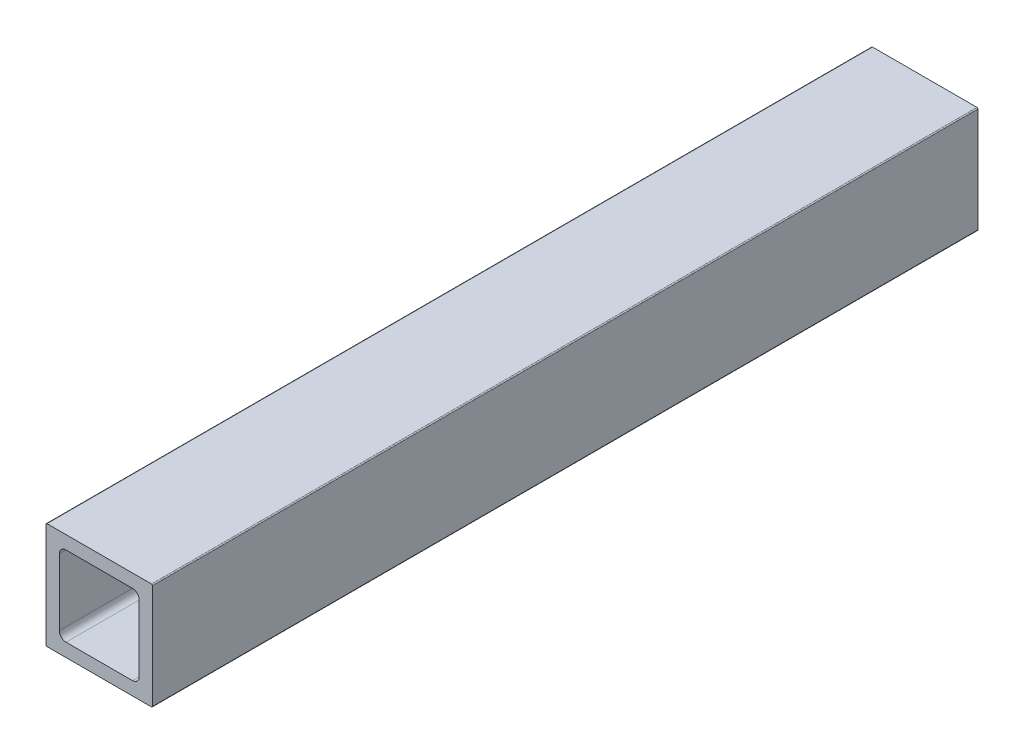
ISO-10303-21;
HEADER;
FILE_DESCRIPTION(('STEP AP214'),'2;1');
FILE_NAME('part.step','',(''),(''),'','','');
FILE_SCHEMA(('AUTOMOTIVE_DESIGN { 1 0 10303 214 1 1 1 1 }'));
ENDSEC;
DATA;
#1=APPLICATION_CONTEXT('core data for automotive mechanical design processes');
#2=APPLICATION_PROTOCOL_DEFINITION('international standard','automotive_design',2000,#1);
#3=PRODUCT_CONTEXT('',#1,'mechanical');
#4=PRODUCT('Part','Part','',(#3));
#5=PRODUCT_RELATED_PRODUCT_CATEGORY('part','',(#4));
#6=PRODUCT_DEFINITION_FORMATION('','',#4);
#7=PRODUCT_DEFINITION_CONTEXT('part definition',#1,'design');
#8=PRODUCT_DEFINITION('design','',#6,#7);
#9=PRODUCT_DEFINITION_SHAPE('','',#8);
#10=(LENGTH_UNIT() NAMED_UNIT(*) SI_UNIT(.MILLI.,.METRE.));
#11=(NAMED_UNIT(*) PLANE_ANGLE_UNIT() SI_UNIT($,.RADIAN.));
#12=(NAMED_UNIT(*) SI_UNIT($,.STERADIAN.) SOLID_ANGLE_UNIT());
#13=UNCERTAINTY_MEASURE_WITH_UNIT(LENGTH_MEASURE(1.E-05),#10,'distance_accuracy_value','');
#14=(GEOMETRIC_REPRESENTATION_CONTEXT(3) GLOBAL_UNCERTAINTY_ASSIGNED_CONTEXT((#13)) GLOBAL_UNIT_ASSIGNED_CONTEXT((#10,
#11,#12)) REPRESENTATION_CONTEXT('',''));
#15=CARTESIAN_POINT('',(0.,0.,0.));
#16=DIRECTION('',(0.,0.,1.));
#17=DIRECTION('',(1.,0.,0.));
#18=AXIS2_PLACEMENT_3D('',#15,#16,#17);
#19=CARTESIAN_POINT('',(0.254,0.254,0.));
#20=DIRECTION('',(0.,0.,-1.));
#21=DIRECTION('',(0.,-1.,0.));
#22=AXIS2_PLACEMENT_3D('',#19,#20,#21);
#23=PLANE('',#22);
#24=CARTESIAN_POINT('',(0.254,0.254,0.));
#25=DIRECTION('',(0.,0.,1.));
#26=DIRECTION('',(-1.,0.,0.));
#27=AXIS2_PLACEMENT_3D('',#24,#25,#26);
#28=CIRCLE('',#27,0.254);
#29=CARTESIAN_POINT('',(0.,0.254,0.));
#30=VERTEX_POINT('',#29);
#31=CARTESIAN_POINT('',(0.254,0.,0.));
#32=VERTEX_POINT('',#31);
#33=EDGE_CURVE('E193',#30,#32,#28,.T.);
#34=ORIENTED_EDGE('',*,*,#33,.F.);
#35=DIRECTION('',(0.,-1.,0.));
#36=VECTOR('',#35,1.);
#37=CARTESIAN_POINT('',(0.,0.254,0.));
#38=LINE('',#37,#36);
#39=CARTESIAN_POINT('',(0.,25.146,0.));
#40=VERTEX_POINT('',#39);
#41=EDGE_CURVE('E191',#40,#30,#38,.T.);
#42=ORIENTED_EDGE('',*,*,#41,.F.);
#43=CARTESIAN_POINT('',(0.254,25.146,0.));
#44=DIRECTION('',(0.,0.,1.));
#45=DIRECTION('',(-1.,0.,0.));
#46=AXIS2_PLACEMENT_3D('',#43,#44,#45);
#47=CIRCLE('',#46,0.254);
#48=CARTESIAN_POINT('',(0.254,25.4,0.));
#49=VERTEX_POINT('',#48);
#50=EDGE_CURVE('E213',#49,#40,#47,.T.);
#51=ORIENTED_EDGE('',*,*,#50,.F.);
#52=DIRECTION('',(-1.,0.,0.));
#53=VECTOR('',#52,1.);
#54=CARTESIAN_POINT('',(0.254,25.4,0.));
#55=LINE('',#54,#53);
#56=CARTESIAN_POINT('',(25.146,25.4,0.));
#57=VERTEX_POINT('',#56);
#58=EDGE_CURVE('E204',#57,#49,#55,.T.);
#59=ORIENTED_EDGE('',*,*,#58,.F.);
#60=CARTESIAN_POINT('',(25.146,25.146,0.));
#61=DIRECTION('',(0.,0.,1.));
#62=DIRECTION('',(-1.,0.,0.));
#63=AXIS2_PLACEMENT_3D('',#60,#61,#62);
#64=CIRCLE('',#63,0.254);
#65=CARTESIAN_POINT('',(25.4,25.146,0.));
#66=VERTEX_POINT('',#65);
#67=EDGE_CURVE('E236',#66,#57,#64,.T.);
#68=ORIENTED_EDGE('',*,*,#67,.F.);
#69=DIRECTION('',(0.,1.,0.));
#70=VECTOR('',#69,1.);
#71=CARTESIAN_POINT('',(25.4,0.254,0.));
#72=LINE('',#71,#70);
#73=CARTESIAN_POINT('',(25.4,0.254,0.));
#74=VERTEX_POINT('',#73);
#75=EDGE_CURVE('E235',#74,#66,#72,.T.);
#76=ORIENTED_EDGE('',*,*,#75,.F.);
#77=CARTESIAN_POINT('',(25.146,0.254,0.));
#78=DIRECTION('',(0.,0.,1.));
#79=DIRECTION('',(1.,0.,0.));
#80=AXIS2_PLACEMENT_3D('',#77,#78,#79);
#81=CIRCLE('',#80,0.254);
#82=CARTESIAN_POINT('',(25.146,0.,0.));
#83=VERTEX_POINT('',#82);
#84=EDGE_CURVE('E206',#83,#74,#81,.T.);
#85=ORIENTED_EDGE('',*,*,#84,.F.);
#86=DIRECTION('',(1.,0.,0.));
#87=VECTOR('',#86,1.);
#88=CARTESIAN_POINT('',(0.254,0.,0.));
#89=LINE('',#88,#87);
#90=EDGE_CURVE('E194',#32,#83,#89,.T.);
#91=ORIENTED_EDGE('',*,*,#90,.F.);
#92=EDGE_LOOP('',(#34,#42,#51,#59,#68,#76,#85,#91));
#93=FACE_BOUND('',#92,.T.);
#94=DIRECTION('',(0.,-1.,0.));
#95=VECTOR('',#94,1.);
#96=CARTESIAN_POINT('',(3.175,4.7625,0.));
#97=LINE('',#96,#95);
#98=CARTESIAN_POINT('',(3.175,20.6375,0.));
#99=VERTEX_POINT('',#98);
#100=CARTESIAN_POINT('',(3.175,4.7625,0.));
#101=VERTEX_POINT('',#100);
#102=EDGE_CURVE('E52',#99,#101,#97,.T.);
#103=ORIENTED_EDGE('',*,*,#102,.T.);
#104=CARTESIAN_POINT('',(4.7625,4.7625,0.));
#105=DIRECTION('',(0.,0.,1.));
#106=DIRECTION('',(1.,0.,0.));
#107=AXIS2_PLACEMENT_3D('',#104,#105,#106);
#108=CIRCLE('',#107,1.5875);
#109=CARTESIAN_POINT('',(4.7625,3.175,0.));
#110=VERTEX_POINT('',#109);
#111=EDGE_CURVE('E266',#101,#110,#108,.T.);
#112=ORIENTED_EDGE('',*,*,#111,.T.);
#113=DIRECTION('',(1.,0.,0.));
#114=VECTOR('',#113,1.);
#115=CARTESIAN_POINT('',(4.7625,3.175,0.));
#116=LINE('',#115,#114);
#117=CARTESIAN_POINT('',(20.6375,3.175,0.));
#118=VERTEX_POINT('',#117);
#119=EDGE_CURVE('E250',#110,#118,#116,.T.);
#120=ORIENTED_EDGE('',*,*,#119,.T.);
#121=CARTESIAN_POINT('',(20.6375,4.7625,0.));
#122=DIRECTION('',(0.,0.,1.));
#123=DIRECTION('',(-1.,0.,0.));
#124=AXIS2_PLACEMENT_3D('',#121,#122,#123);
#125=CIRCLE('',#124,1.5875);
#126=CARTESIAN_POINT('',(22.225,4.7625,0.));
#127=VERTEX_POINT('',#126);
#128=EDGE_CURVE('E223',#118,#127,#125,.T.);
#129=ORIENTED_EDGE('',*,*,#128,.T.);
#130=DIRECTION('',(0.,1.,0.));
#131=VECTOR('',#130,1.);
#132=CARTESIAN_POINT('',(22.225,4.7625,0.));
#133=LINE('',#132,#131);
#134=CARTESIAN_POINT('',(22.225,20.6375,0.));
#135=VERTEX_POINT('',#134);
#136=EDGE_CURVE('E219',#127,#135,#133,.T.);
#137=ORIENTED_EDGE('',*,*,#136,.T.);
#138=CARTESIAN_POINT('',(20.6375,20.6375,0.));
#139=DIRECTION('',(0.,0.,1.));
#140=DIRECTION('',(-1.,0.,0.));
#141=AXIS2_PLACEMENT_3D('',#138,#139,#140);
#142=CIRCLE('',#141,1.5875);
#143=CARTESIAN_POINT('',(20.6375,22.225,0.));
#144=VERTEX_POINT('',#143);
#145=EDGE_CURVE('E224',#135,#144,#142,.T.);
#146=ORIENTED_EDGE('',*,*,#145,.T.);
#147=DIRECTION('',(-1.,0.,0.));
#148=VECTOR('',#147,1.);
#149=CARTESIAN_POINT('',(4.7625,22.225,0.));
#150=LINE('',#149,#148);
#151=CARTESIAN_POINT('',(4.7625,22.225,0.));
#152=VERTEX_POINT('',#151);
#153=EDGE_CURVE('E229',#144,#152,#150,.T.);
#154=ORIENTED_EDGE('',*,*,#153,.T.);
#155=CARTESIAN_POINT('',(4.7625,20.6375,0.));
#156=DIRECTION('',(0.,0.,1.));
#157=DIRECTION('',(-1.,0.,0.));
#158=AXIS2_PLACEMENT_3D('',#155,#156,#157);
#159=CIRCLE('',#158,1.5875);
#160=EDGE_CURVE('E197',#152,#99,#159,.T.);
#161=ORIENTED_EDGE('',*,*,#160,.T.);
#162=EDGE_LOOP('',(#103,#112,#120,#129,#137,#146,#154,#161));
#163=FACE_BOUND('',#162,.T.);
#164=ADVANCED_FACE('F44',(#93,#163),#23,.T.);
#165=CARTESIAN_POINT('',(0.254,0.254,1828.8));
#166=DIRECTION('',(0.,0.,-1.));
#167=DIRECTION('',(-1.,0.,0.));
#168=AXIS2_PLACEMENT_3D('',#165,#166,#167);
#169=CYLINDRICAL_SURFACE('',#168,0.254);
#170=CARTESIAN_POINT('',(0.254,0.254,196.85));
#171=DIRECTION('',(0.,0.,-1.));
#172=DIRECTION('',(-1.,0.,0.));
#173=AXIS2_PLACEMENT_3D('',#170,#171,#172);
#174=CIRCLE('',#173,0.254);
#175=CARTESIAN_POINT('',(0.,0.254,196.85));
#176=VERTEX_POINT('',#175);
#177=CARTESIAN_POINT('',(0.254,0.,196.85));
#178=VERTEX_POINT('',#177);
#179=EDGE_CURVE('E172',#176,#178,#174,.F.);
#180=ORIENTED_EDGE('',*,*,#179,.F.);
#181=DIRECTION('',(0.,0.,-1.));
#182=VECTOR('',#181,1.);
#183=CARTESIAN_POINT('',(0.,0.254,1828.8));
#184=LINE('',#183,#182);
#185=EDGE_CURVE('E183',#176,#30,#184,.T.);
#186=ORIENTED_EDGE('',*,*,#185,.T.);
#187=ORIENTED_EDGE('',*,*,#33,.T.);
#188=DIRECTION('',(0.,0.,-1.));
#189=VECTOR('',#188,1.);
#190=CARTESIAN_POINT('',(0.254,0.,1828.8));
#191=LINE('',#190,#189);
#192=EDGE_CURVE('E185',#178,#32,#191,.T.);
#193=ORIENTED_EDGE('',*,*,#192,.F.);
#194=EDGE_LOOP('',(#180,#186,#187,#193));
#195=FACE_BOUND('',#194,.T.);
#196=ADVANCED_FACE('F181',(#195),#169,.T.);
#197=CARTESIAN_POINT('',(0.254,0.,1828.8));
#198=DIRECTION('',(0.,1.,0.));
#199=DIRECTION('',(1.,0.,0.));
#200=AXIS2_PLACEMENT_3D('',#197,#198,#199);
#201=PLANE('',#200);
#202=DIRECTION('',(0.,0.,-1.));
#203=VECTOR('',#202,1.);
#204=CARTESIAN_POINT('',(25.146,0.,1828.8));
#205=LINE('',#204,#203);
#206=CARTESIAN_POINT('',(25.146,0.,196.85));
#207=VERTEX_POINT('',#206);
#208=EDGE_CURVE('E210',#207,#83,#205,.T.);
#209=ORIENTED_EDGE('',*,*,#208,.F.);
#210=DIRECTION('',(1.,0.,0.));
#211=VECTOR('',#210,1.);
#212=CARTESIAN_POINT('',(0.,0.,196.85));
#213=LINE('',#212,#211);
#214=EDGE_CURVE('E177',#178,#207,#213,.T.);
#215=ORIENTED_EDGE('',*,*,#214,.F.);
#216=ORIENTED_EDGE('',*,*,#192,.T.);
#217=ORIENTED_EDGE('',*,*,#90,.T.);
#218=EDGE_LOOP('',(#209,#215,#216,#217));
#219=FACE_BOUND('',#218,.T.);
#220=ADVANCED_FACE('F289',(#219),#201,.F.);
#221=CARTESIAN_POINT('',(25.146,0.254,1828.8));
#222=DIRECTION('',(0.,0.,-1.));
#223=DIRECTION('',(-1.,0.,0.));
#224=AXIS2_PLACEMENT_3D('',#221,#222,#223);
#225=CYLINDRICAL_SURFACE('',#224,0.254);
#226=CARTESIAN_POINT('',(25.146,0.254,196.85));
#227=DIRECTION('',(0.,0.,-1.));
#228=DIRECTION('',(-1.,0.,0.));
#229=AXIS2_PLACEMENT_3D('',#226,#227,#228);
#230=CIRCLE('',#229,0.254);
#231=CARTESIAN_POINT('',(25.4,0.254,196.85));
#232=VERTEX_POINT('',#231);
#233=EDGE_CURVE('E187',#207,#232,#230,.F.);
#234=ORIENTED_EDGE('',*,*,#233,.F.);
#235=ORIENTED_EDGE('',*,*,#208,.T.);
#236=ORIENTED_EDGE('',*,*,#84,.T.);
#237=DIRECTION('',(0.,0.,-1.));
#238=VECTOR('',#237,1.);
#239=CARTESIAN_POINT('',(25.4,0.254,1828.8));
#240=LINE('',#239,#238);
#241=EDGE_CURVE('E233',#232,#74,#240,.T.);
#242=ORIENTED_EDGE('',*,*,#241,.F.);
#243=EDGE_LOOP('',(#234,#235,#236,#242));
#244=FACE_BOUND('',#243,.T.);
#245=ADVANCED_FACE('F283',(#244),#225,.T.);
#246=CARTESIAN_POINT('',(25.4,0.254,1828.8));
#247=DIRECTION('',(-1.,0.,0.));
#248=DIRECTION('',(0.,0.,1.));
#249=AXIS2_PLACEMENT_3D('',#246,#247,#248);
#250=PLANE('',#249);
#251=DIRECTION('',(0.,0.,-1.));
#252=VECTOR('',#251,1.);
#253=CARTESIAN_POINT('',(25.4,25.146,1828.8));
#254=LINE('',#253,#252);
#255=CARTESIAN_POINT('',(25.4,25.146,196.85));
#256=VERTEX_POINT('',#255);
#257=EDGE_CURVE('E258',#256,#66,#254,.T.);
#258=ORIENTED_EDGE('',*,*,#257,.F.);
#259=DIRECTION('',(0.,1.,0.));
#260=VECTOR('',#259,1.);
#261=CARTESIAN_POINT('',(25.4,0.,196.85));
#262=LINE('',#261,#260);
#263=EDGE_CURVE('E498',#232,#256,#262,.T.);
#264=ORIENTED_EDGE('',*,*,#263,.F.);
#265=ORIENTED_EDGE('',*,*,#241,.T.);
#266=ORIENTED_EDGE('',*,*,#75,.T.);
#267=EDGE_LOOP('',(#258,#264,#265,#266));
#268=FACE_BOUND('',#267,.T.);
#269=ADVANCED_FACE('F288',(#268),#250,.F.);
#270=CARTESIAN_POINT('',(25.146,25.146,1828.8));
#271=DIRECTION('',(0.,0.,-1.));
#272=DIRECTION('',(-1.,0.,0.));
#273=AXIS2_PLACEMENT_3D('',#270,#271,#272);
#274=CYLINDRICAL_SURFACE('',#273,0.254);
#275=CARTESIAN_POINT('',(25.146,25.146,196.85));
#276=DIRECTION('',(0.,0.,-1.));
#277=DIRECTION('',(-1.,0.,0.));
#278=AXIS2_PLACEMENT_3D('',#275,#276,#277);
#279=CIRCLE('',#278,0.254);
#280=CARTESIAN_POINT('',(25.146,25.4,196.85));
#281=VERTEX_POINT('',#280);
#282=EDGE_CURVE('E492',#256,#281,#279,.F.);
#283=ORIENTED_EDGE('',*,*,#282,.F.);
#284=ORIENTED_EDGE('',*,*,#257,.T.);
#285=ORIENTED_EDGE('',*,*,#67,.T.);
#286=DIRECTION('',(0.,0.,-1.));
#287=VECTOR('',#286,1.);
#288=CARTESIAN_POINT('',(25.146,25.4,1828.8));
#289=LINE('',#288,#287);
#290=EDGE_CURVE('E227',#281,#57,#289,.T.);
#291=ORIENTED_EDGE('',*,*,#290,.F.);
#292=EDGE_LOOP('',(#283,#284,#285,#291));
#293=FACE_BOUND('',#292,.T.);
#294=ADVANCED_FACE('F46',(#293),#274,.T.);
#295=CARTESIAN_POINT('',(0.254,25.4,1828.8));
#296=DIRECTION('',(0.,-1.,0.));
#297=DIRECTION('',(0.,0.,-1.));
#298=AXIS2_PLACEMENT_3D('',#295,#296,#297);
#299=PLANE('',#298);
#300=DIRECTION('',(0.,0.,-1.));
#301=VECTOR('',#300,1.);
#302=CARTESIAN_POINT('',(0.254,25.4,1828.8));
#303=LINE('',#302,#301);
#304=CARTESIAN_POINT('',(0.254,25.4,196.85));
#305=VERTEX_POINT('',#304);
#306=EDGE_CURVE('E211',#305,#49,#303,.T.);
#307=ORIENTED_EDGE('',*,*,#306,.F.);
#308=DIRECTION('',(-1.,0.,0.));
#309=VECTOR('',#308,1.);
#310=CARTESIAN_POINT('',(0.,25.4,196.85));
#311=LINE('',#310,#309);
#312=EDGE_CURVE('E545',#281,#305,#311,.T.);
#313=ORIENTED_EDGE('',*,*,#312,.F.);
#314=ORIENTED_EDGE('',*,*,#290,.T.);
#315=ORIENTED_EDGE('',*,*,#58,.T.);
#316=EDGE_LOOP('',(#307,#313,#314,#315));
#317=FACE_BOUND('',#316,.T.);
#318=ADVANCED_FACE('F347',(#317),#299,.F.);
#319=CARTESIAN_POINT('',(0.254,25.146,1828.8));
#320=DIRECTION('',(0.,0.,-1.));
#321=DIRECTION('',(-1.,0.,0.));
#322=AXIS2_PLACEMENT_3D('',#319,#320,#321);
#323=CYLINDRICAL_SURFACE('',#322,0.254);
#324=CARTESIAN_POINT('',(0.254,25.146,196.85));
#325=DIRECTION('',(0.,0.,-1.));
#326=DIRECTION('',(-1.,0.,0.));
#327=AXIS2_PLACEMENT_3D('',#324,#325,#326);
#328=CIRCLE('',#327,0.254);
#329=CARTESIAN_POINT('',(0.,25.146,196.85));
#330=VERTEX_POINT('',#329);
#331=EDGE_CURVE('E59',#305,#330,#328,.F.);
#332=ORIENTED_EDGE('',*,*,#331,.F.);
#333=ORIENTED_EDGE('',*,*,#306,.T.);
#334=ORIENTED_EDGE('',*,*,#50,.T.);
#335=DIRECTION('',(0.,0.,-1.));
#336=VECTOR('',#335,1.);
#337=CARTESIAN_POINT('',(0.,25.146,1828.8));
#338=LINE('',#337,#336);
#339=EDGE_CURVE('E216',#330,#40,#338,.T.);
#340=ORIENTED_EDGE('',*,*,#339,.F.);
#341=EDGE_LOOP('',(#332,#333,#334,#340));
#342=FACE_BOUND('',#341,.T.);
#343=ADVANCED_FACE('F276',(#342),#323,.T.);
#344=CARTESIAN_POINT('',(0.,0.254,1828.8));
#345=DIRECTION('',(1.,0.,0.));
#346=DIRECTION('',(0.,1.,0.));
#347=AXIS2_PLACEMENT_3D('',#344,#345,#346);
#348=PLANE('',#347);
#349=ORIENTED_EDGE('',*,*,#185,.F.);
#350=DIRECTION('',(0.,-1.,0.));
#351=VECTOR('',#350,1.);
#352=CARTESIAN_POINT('',(0.,0.,196.85));
#353=LINE('',#352,#351);
#354=EDGE_CURVE('E169',#330,#176,#353,.T.);
#355=ORIENTED_EDGE('',*,*,#354,.F.);
#356=ORIENTED_EDGE('',*,*,#339,.T.);
#357=ORIENTED_EDGE('',*,*,#41,.T.);
#358=EDGE_LOOP('',(#349,#355,#356,#357));
#359=FACE_BOUND('',#358,.T.);
#360=ADVANCED_FACE('F189',(#359),#348,.F.);
#361=CARTESIAN_POINT('',(4.7625,4.7625,1828.8));
#362=DIRECTION('',(0.,0.,-1.));
#363=DIRECTION('',(-1.,0.,0.));
#364=AXIS2_PLACEMENT_3D('',#361,#362,#363);
#365=CYLINDRICAL_SURFACE('',#364,1.5875);
#366=DIRECTION('',(0.,0.,-1.));
#367=VECTOR('',#366,1.);
#368=CARTESIAN_POINT('',(3.175,4.7625,1828.8));
#369=LINE('',#368,#367);
#370=CARTESIAN_POINT('',(3.175,4.7625,196.85));
#371=VERTEX_POINT('',#370);
#372=EDGE_CURVE('E186',#371,#101,#369,.T.);
#373=ORIENTED_EDGE('',*,*,#372,.F.);
#374=CARTESIAN_POINT('',(4.7625,4.7625,196.85));
#375=DIRECTION('',(0.,0.,-1.));
#376=DIRECTION('',(-1.,0.,0.));
#377=AXIS2_PLACEMENT_3D('',#374,#375,#376);
#378=CIRCLE('',#377,1.5875);
#379=CARTESIAN_POINT('',(4.7625,3.175,196.85));
#380=VERTEX_POINT('',#379);
#381=EDGE_CURVE('E66',#371,#380,#378,.F.);
#382=ORIENTED_EDGE('',*,*,#381,.T.);
#383=DIRECTION('',(0.,0.,-1.));
#384=VECTOR('',#383,1.);
#385=CARTESIAN_POINT('',(4.7625,3.175,1828.8));
#386=LINE('',#385,#384);
#387=EDGE_CURVE('E214',#380,#110,#386,.T.);
#388=ORIENTED_EDGE('',*,*,#387,.T.);
#389=ORIENTED_EDGE('',*,*,#111,.F.);
#390=EDGE_LOOP('',(#373,#382,#388,#389));
#391=FACE_BOUND('',#390,.T.);
#392=ADVANCED_FACE('F275',(#391),#365,.F.);
#393=CARTESIAN_POINT('',(4.7625,3.175,1828.8));
#394=DIRECTION('',(0.,1.,0.));
#395=DIRECTION('',(1.,0.,0.));
#396=AXIS2_PLACEMENT_3D('',#393,#394,#395);
#397=PLANE('',#396);
#398=DIRECTION('',(-1.,0.,0.));
#399=VECTOR('',#398,1.);
#400=CARTESIAN_POINT('',(4.7625,3.175,196.85));
#401=LINE('',#400,#399);
#402=CARTESIAN_POINT('',(20.6375,3.175,196.85));
#403=VERTEX_POINT('',#402);
#404=EDGE_CURVE('E532',#403,#380,#401,.T.);
#405=ORIENTED_EDGE('',*,*,#404,.F.);
#406=DIRECTION('',(0.,0.,-1.));
#407=VECTOR('',#406,1.);
#408=CARTESIAN_POINT('',(20.6375,3.175,1828.8));
#409=LINE('',#408,#407);
#410=EDGE_CURVE('E217',#403,#118,#409,.T.);
#411=ORIENTED_EDGE('',*,*,#410,.T.);
#412=ORIENTED_EDGE('',*,*,#119,.F.);
#413=ORIENTED_EDGE('',*,*,#387,.F.);
#414=EDGE_LOOP('',(#405,#411,#412,#413));
#415=FACE_BOUND('',#414,.T.);
#416=ADVANCED_FACE('F302',(#415),#397,.T.);
#417=CARTESIAN_POINT('',(20.6375,4.7625,1828.8));
#418=DIRECTION('',(0.,0.,-1.));
#419=DIRECTION('',(-1.,0.,0.));
#420=AXIS2_PLACEMENT_3D('',#417,#418,#419);
#421=CYLINDRICAL_SURFACE('',#420,1.5875);
#422=ORIENTED_EDGE('',*,*,#410,.F.);
#423=CARTESIAN_POINT('',(20.6375,4.7625,196.85));
#424=DIRECTION('',(0.,0.,-1.));
#425=DIRECTION('',(-1.,0.,0.));
#426=AXIS2_PLACEMENT_3D('',#423,#424,#425);
#427=CIRCLE('',#426,1.5875);
#428=CARTESIAN_POINT('',(22.225,4.7625,196.85));
#429=VERTEX_POINT('',#428);
#430=EDGE_CURVE('E513',#403,#429,#427,.F.);
#431=ORIENTED_EDGE('',*,*,#430,.T.);
#432=DIRECTION('',(0.,0.,-1.));
#433=VECTOR('',#432,1.);
#434=CARTESIAN_POINT('',(22.225,4.7625,1828.8));
#435=LINE('',#434,#433);
#436=EDGE_CURVE('E254',#429,#127,#435,.T.);
#437=ORIENTED_EDGE('',*,*,#436,.T.);
#438=ORIENTED_EDGE('',*,*,#128,.F.);
#439=EDGE_LOOP('',(#422,#431,#437,#438));
#440=FACE_BOUND('',#439,.T.);
#441=ADVANCED_FACE('F297',(#440),#421,.F.);
#442=CARTESIAN_POINT('',(22.225,4.7625,1828.8));
#443=DIRECTION('',(-1.,0.,0.));
#444=DIRECTION('',(0.,0.,1.));
#445=AXIS2_PLACEMENT_3D('',#442,#443,#444);
#446=PLANE('',#445);
#447=DIRECTION('',(0.,-1.,0.));
#448=VECTOR('',#447,1.);
#449=CARTESIAN_POINT('',(22.225,4.7625,196.85));
#450=LINE('',#449,#448);
#451=CARTESIAN_POINT('',(22.225,20.6375,196.85));
#452=VERTEX_POINT('',#451);
#453=EDGE_CURVE('E535',#452,#429,#450,.T.);
#454=ORIENTED_EDGE('',*,*,#453,.F.);
#455=DIRECTION('',(0.,0.,-1.));
#456=VECTOR('',#455,1.);
#457=CARTESIAN_POINT('',(22.225,20.6375,1828.8));
#458=LINE('',#457,#456);
#459=EDGE_CURVE('E240',#452,#135,#458,.T.);
#460=ORIENTED_EDGE('',*,*,#459,.T.);
#461=ORIENTED_EDGE('',*,*,#136,.F.);
#462=ORIENTED_EDGE('',*,*,#436,.F.);
#463=EDGE_LOOP('',(#454,#460,#461,#462));
#464=FACE_BOUND('',#463,.T.);
#465=ADVANCED_FACE('F301',(#464),#446,.T.);
#466=CARTESIAN_POINT('',(20.6375,20.6375,1828.8));
#467=DIRECTION('',(0.,0.,-1.));
#468=DIRECTION('',(-1.,0.,0.));
#469=AXIS2_PLACEMENT_3D('',#466,#467,#468);
#470=CYLINDRICAL_SURFACE('',#469,1.5875);
#471=ORIENTED_EDGE('',*,*,#459,.F.);
#472=CARTESIAN_POINT('',(20.6375,20.6375,196.85));
#473=DIRECTION('',(0.,0.,-1.));
#474=DIRECTION('',(-1.,0.,0.));
#475=AXIS2_PLACEMENT_3D('',#472,#473,#474);
#476=CIRCLE('',#475,1.5875);
#477=CARTESIAN_POINT('',(20.6375,22.225,196.85));
#478=VERTEX_POINT('',#477);
#479=EDGE_CURVE('E537',#452,#478,#476,.F.);
#480=ORIENTED_EDGE('',*,*,#479,.T.);
#481=DIRECTION('',(0.,0.,-1.));
#482=VECTOR('',#481,1.);
#483=CARTESIAN_POINT('',(20.6375,22.225,1828.8));
#484=LINE('',#483,#482);
#485=EDGE_CURVE('E238',#478,#144,#484,.T.);
#486=ORIENTED_EDGE('',*,*,#485,.T.);
#487=ORIENTED_EDGE('',*,*,#145,.F.);
#488=EDGE_LOOP('',(#471,#480,#486,#487));
#489=FACE_BOUND('',#488,.T.);
#490=ADVANCED_FACE('F309',(#489),#470,.F.);
#491=CARTESIAN_POINT('',(4.7625,22.225,1828.8));
#492=DIRECTION('',(0.,-1.,0.));
#493=DIRECTION('',(0.,0.,-1.));
#494=AXIS2_PLACEMENT_3D('',#491,#492,#493);
#495=PLANE('',#494);
#496=DIRECTION('',(1.,0.,0.));
#497=VECTOR('',#496,1.);
#498=CARTESIAN_POINT('',(4.7625,22.225,196.85));
#499=LINE('',#498,#497);
#500=CARTESIAN_POINT('',(4.7625,22.225,196.85));
#501=VERTEX_POINT('',#500);
#502=EDGE_CURVE('E540',#501,#478,#499,.T.);
#503=ORIENTED_EDGE('',*,*,#502,.F.);
#504=DIRECTION('',(0.,0.,-1.));
#505=VECTOR('',#504,1.);
#506=CARTESIAN_POINT('',(4.7625,22.225,1828.8));
#507=LINE('',#506,#505);
#508=EDGE_CURVE('E241',#501,#152,#507,.T.);
#509=ORIENTED_EDGE('',*,*,#508,.T.);
#510=ORIENTED_EDGE('',*,*,#153,.F.);
#511=ORIENTED_EDGE('',*,*,#485,.F.);
#512=EDGE_LOOP('',(#503,#509,#510,#511));
#513=FACE_BOUND('',#512,.T.);
#514=ADVANCED_FACE('F313',(#513),#495,.T.);
#515=CARTESIAN_POINT('',(4.7625,20.6375,1828.8));
#516=DIRECTION('',(0.,0.,-1.));
#517=DIRECTION('',(-1.,0.,0.));
#518=AXIS2_PLACEMENT_3D('',#515,#516,#517);
#519=CYLINDRICAL_SURFACE('',#518,1.5875);
#520=ORIENTED_EDGE('',*,*,#508,.F.);
#521=CARTESIAN_POINT('',(4.7625,20.6375,196.85));
#522=DIRECTION('',(0.,0.,-1.));
#523=DIRECTION('',(-1.,0.,0.));
#524=AXIS2_PLACEMENT_3D('',#521,#522,#523);
#525=CIRCLE('',#524,1.5875);
#526=CARTESIAN_POINT('',(3.175,20.6375,196.85));
#527=VERTEX_POINT('',#526);
#528=EDGE_CURVE('E542',#501,#527,#525,.F.);
#529=ORIENTED_EDGE('',*,*,#528,.T.);
#530=DIRECTION('',(0.,0.,-1.));
#531=VECTOR('',#530,1.);
#532=CARTESIAN_POINT('',(3.175,20.6375,1828.8));
#533=LINE('',#532,#531);
#534=EDGE_CURVE('E245',#527,#99,#533,.T.);
#535=ORIENTED_EDGE('',*,*,#534,.T.);
#536=ORIENTED_EDGE('',*,*,#160,.F.);
#537=EDGE_LOOP('',(#520,#529,#535,#536));
#538=FACE_BOUND('',#537,.T.);
#539=ADVANCED_FACE('F390',(#538),#519,.F.);
#540=CARTESIAN_POINT('',(3.175,4.7625,1828.8));
#541=DIRECTION('',(1.,0.,0.));
#542=DIRECTION('',(0.,1.,0.));
#543=AXIS2_PLACEMENT_3D('',#540,#541,#542);
#544=PLANE('',#543);
#545=DIRECTION('',(0.,1.,0.));
#546=VECTOR('',#545,1.);
#547=CARTESIAN_POINT('',(3.175,4.7625,196.85));
#548=LINE('',#547,#546);
#549=EDGE_CURVE('E11',#371,#527,#548,.T.);
#550=ORIENTED_EDGE('',*,*,#549,.F.);
#551=ORIENTED_EDGE('',*,*,#372,.T.);
#552=ORIENTED_EDGE('',*,*,#102,.F.);
#553=ORIENTED_EDGE('',*,*,#534,.F.);
#554=EDGE_LOOP('',(#550,#551,#552,#553));
#555=FACE_BOUND('',#554,.T.);
#556=ADVANCED_FACE('F394',(#555),#544,.T.);
#557=CARTESIAN_POINT('',(0.,0.,196.85));
#558=DIRECTION('',(0.,0.,-1.));
#559=DIRECTION('',(-1.,0.,0.));
#560=AXIS2_PLACEMENT_3D('',#557,#558,#559);
#561=PLANE('',#560);
#562=ORIENTED_EDGE('',*,*,#179,.T.);
#563=ORIENTED_EDGE('',*,*,#214,.T.);
#564=ORIENTED_EDGE('',*,*,#233,.T.);
#565=ORIENTED_EDGE('',*,*,#263,.T.);
#566=ORIENTED_EDGE('',*,*,#282,.T.);
#567=ORIENTED_EDGE('',*,*,#312,.T.);
#568=ORIENTED_EDGE('',*,*,#331,.T.);
#569=ORIENTED_EDGE('',*,*,#354,.T.);
#570=EDGE_LOOP('',(#562,#563,#564,#565,#566,#567,#568,#569));
#571=FACE_BOUND('',#570,.T.);
#572=ORIENTED_EDGE('',*,*,#549,.T.);
#573=ORIENTED_EDGE('',*,*,#528,.F.);
#574=ORIENTED_EDGE('',*,*,#502,.T.);
#575=ORIENTED_EDGE('',*,*,#479,.F.);
#576=ORIENTED_EDGE('',*,*,#453,.T.);
#577=ORIENTED_EDGE('',*,*,#430,.F.);
#578=ORIENTED_EDGE('',*,*,#404,.T.);
#579=ORIENTED_EDGE('',*,*,#381,.F.);
#580=EDGE_LOOP('',(#572,#573,#574,#575,#576,#577,#578,#579));
#581=FACE_BOUND('',#580,.T.);
#582=ADVANCED_FACE('F171',(#571,#581),#561,.F.);
#583=CLOSED_SHELL('',(#164,#196,#220,#245,#269,#294,#318,#343,#360,#392,#416,#441,#465,#490,
#514,#539,#556,#582));
#584=MANIFOLD_SOLID_BREP('B2',#583);
#585=ADVANCED_BREP_SHAPE_REPRESENTATION('',(#18,#584),#14);
#586=SHAPE_DEFINITION_REPRESENTATION(#9,#585);
ENDSEC;
END-ISO-10303-21;
